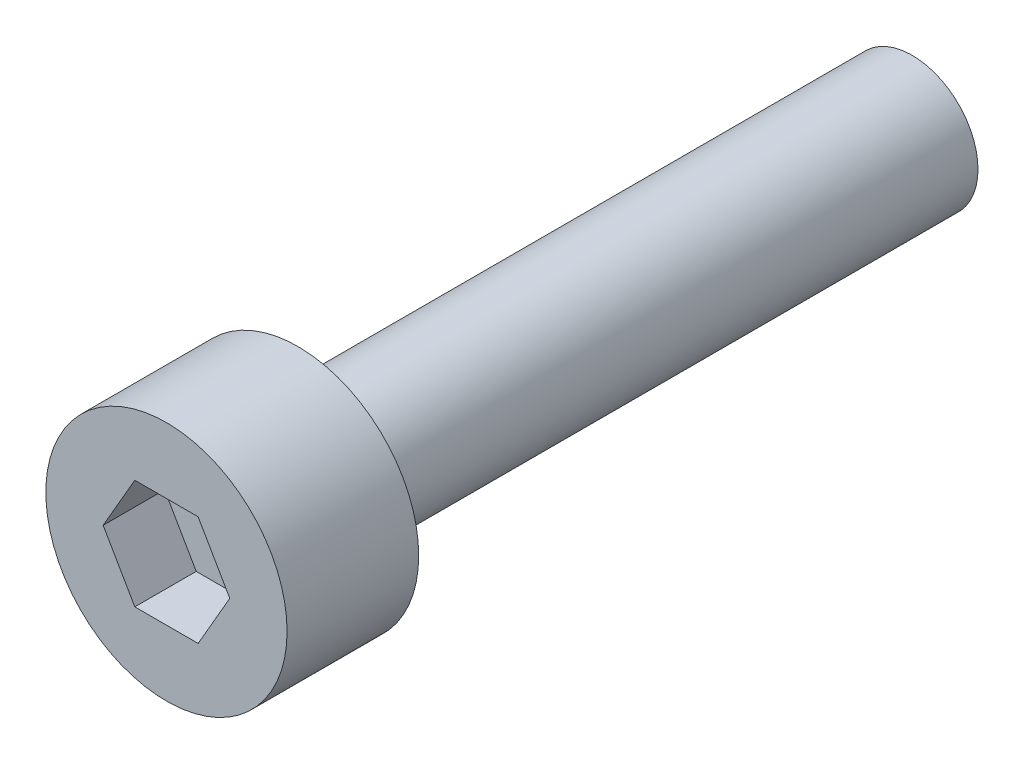
ISO-10303-21;
HEADER;
FILE_DESCRIPTION(('STEP AP214'),'2;1');
FILE_NAME('part.step','',(''),(''),'','','');
FILE_SCHEMA(('AUTOMOTIVE_DESIGN { 1 0 10303 214 1 1 1 1 }'));
ENDSEC;
DATA;
#1=APPLICATION_CONTEXT('core data for automotive mechanical design processes');
#2=APPLICATION_PROTOCOL_DEFINITION('international standard','automotive_design',2000,#1);
#3=PRODUCT_CONTEXT('',#1,'mechanical');
#4=PRODUCT('Part','Part','',(#3));
#5=PRODUCT_RELATED_PRODUCT_CATEGORY('part','',(#4));
#6=PRODUCT_DEFINITION_FORMATION('','',#4);
#7=PRODUCT_DEFINITION_CONTEXT('part definition',#1,'design');
#8=PRODUCT_DEFINITION('design','',#6,#7);
#9=PRODUCT_DEFINITION_SHAPE('','',#8);
#10=(LENGTH_UNIT() NAMED_UNIT(*) SI_UNIT(.MILLI.,.METRE.));
#11=(NAMED_UNIT(*) PLANE_ANGLE_UNIT() SI_UNIT($,.RADIAN.));
#12=(NAMED_UNIT(*) SI_UNIT($,.STERADIAN.) SOLID_ANGLE_UNIT());
#13=UNCERTAINTY_MEASURE_WITH_UNIT(LENGTH_MEASURE(1.E-05),#10,'distance_accuracy_value','');
#14=(GEOMETRIC_REPRESENTATION_CONTEXT(3) GLOBAL_UNCERTAINTY_ASSIGNED_CONTEXT((#13)) GLOBAL_UNIT_ASSIGNED_CONTEXT((#10,
#11,#12)) REPRESENTATION_CONTEXT('',''));
#15=CARTESIAN_POINT('',(0.,0.,0.));
#16=DIRECTION('',(0.,0.,1.));
#17=DIRECTION('',(1.,0.,0.));
#18=AXIS2_PLACEMENT_3D('',#15,#16,#17);
#19=CARTESIAN_POINT('',(0.,0.,3.));
#20=DIRECTION('',(0.,0.,1.));
#21=DIRECTION('',(1.,0.,0.));
#22=AXIS2_PLACEMENT_3D('',#19,#20,#21);
#23=PLANE('',#22);
#24=CARTESIAN_POINT('',(0.,0.,3.));
#25=DIRECTION('',(0.,0.,1.));
#26=DIRECTION('',(1.,0.,0.));
#27=AXIS2_PLACEMENT_3D('',#24,#25,#26);
#28=CIRCLE('',#27,2.75);
#29=CARTESIAN_POINT('',(2.75,0.,3.));
#30=VERTEX_POINT('',#29);
#31=EDGE_CURVE('E11',#30,#30,#28,.T.);
#32=ORIENTED_EDGE('',*,*,#31,.T.);
#33=EDGE_LOOP('',(#32));
#34=FACE_BOUND('',#33,.T.);
#35=DIRECTION('',(-0.5,0.866025403784439,0.));
#36=VECTOR('',#35,1.);
#37=CARTESIAN_POINT('',(1.44337567297406,0.,3.));
#38=LINE('',#37,#36);
#39=CARTESIAN_POINT('',(1.44337567297406,0.,3.));
#40=VERTEX_POINT('',#39);
#41=CARTESIAN_POINT('',(0.721687836487032,1.25,3.));
#42=VERTEX_POINT('',#41);
#43=EDGE_CURVE('E124',#40,#42,#38,.T.);
#44=ORIENTED_EDGE('',*,*,#43,.F.);
#45=DIRECTION('',(0.5,0.866025403784439,0.));
#46=VECTOR('',#45,1.);
#47=CARTESIAN_POINT('',(0.721687836487032,-1.25,3.));
#48=LINE('',#47,#46);
#49=CARTESIAN_POINT('',(0.721687836487032,-1.25,3.));
#50=VERTEX_POINT('',#49);
#51=EDGE_CURVE('E101',#50,#40,#48,.T.);
#52=ORIENTED_EDGE('',*,*,#51,.F.);
#53=DIRECTION('',(1.,0.,0.));
#54=VECTOR('',#53,1.);
#55=CARTESIAN_POINT('',(-0.721687836487033,-1.25,3.));
#56=LINE('',#55,#54);
#57=CARTESIAN_POINT('',(-0.721687836487033,-1.25,3.));
#58=VERTEX_POINT('',#57);
#59=EDGE_CURVE('E70',#58,#50,#56,.T.);
#60=ORIENTED_EDGE('',*,*,#59,.F.);
#61=DIRECTION('',(0.5,-0.866025403784439,0.));
#62=VECTOR('',#61,1.);
#63=CARTESIAN_POINT('',(-1.44337567297406,0.,3.));
#64=LINE('',#63,#62);
#65=CARTESIAN_POINT('',(-1.44337567297406,0.,3.));
#66=VERTEX_POINT('',#65);
#67=EDGE_CURVE('E135',#66,#58,#64,.T.);
#68=ORIENTED_EDGE('',*,*,#67,.F.);
#69=DIRECTION('',(-0.5,-0.866025403784439,0.));
#70=VECTOR('',#69,1.);
#71=CARTESIAN_POINT('',(-0.721687836487032,1.25,3.));
#72=LINE('',#71,#70);
#73=CARTESIAN_POINT('',(-0.721687836487032,1.25,3.));
#74=VERTEX_POINT('',#73);
#75=EDGE_CURVE('E122',#74,#66,#72,.T.);
#76=ORIENTED_EDGE('',*,*,#75,.F.);
#77=DIRECTION('',(-1.,0.,0.));
#78=VECTOR('',#77,1.);
#79=CARTESIAN_POINT('',(0.721687836487032,1.25,3.));
#80=LINE('',#79,#78);
#81=EDGE_CURVE('E109',#42,#74,#80,.T.);
#82=ORIENTED_EDGE('',*,*,#81,.F.);
#83=EDGE_LOOP('',(#44,#52,#60,#68,#76,#82));
#84=FACE_BOUND('',#83,.T.);
#85=ADVANCED_FACE('F50',(#34,#84),#23,.T.);
#86=CARTESIAN_POINT('',(0.,0.,3.));
#87=DIRECTION('',(0.,0.,-1.));
#88=DIRECTION('',(-1.,0.,0.));
#89=AXIS2_PLACEMENT_3D('',#86,#87,#88);
#90=CYLINDRICAL_SURFACE('',#89,2.75);
#91=ORIENTED_EDGE('',*,*,#31,.F.);
#92=EDGE_LOOP('',(#91));
#93=FACE_BOUND('',#92,.T.);
#94=CARTESIAN_POINT('',(0.,0.,0.));
#95=DIRECTION('',(0.,0.,1.));
#96=DIRECTION('',(1.,0.,0.));
#97=AXIS2_PLACEMENT_3D('',#94,#95,#96);
#98=CIRCLE('',#97,2.75);
#99=CARTESIAN_POINT('',(2.75,0.,0.));
#100=VERTEX_POINT('',#99);
#101=EDGE_CURVE('E51',#100,#100,#98,.T.);
#102=ORIENTED_EDGE('',*,*,#101,.T.);
#103=EDGE_LOOP('',(#102));
#104=FACE_BOUND('',#103,.T.);
#105=ADVANCED_FACE('F47',(#93,#104),#90,.T.);
#106=CARTESIAN_POINT('',(0.,0.,0.));
#107=DIRECTION('',(0.,0.,1.));
#108=DIRECTION('',(1.,0.,0.));
#109=AXIS2_PLACEMENT_3D('',#106,#107,#108);
#110=PLANE('',#109);
#111=CARTESIAN_POINT('',(0.,0.,0.));
#112=DIRECTION('',(0.,0.,1.));
#113=DIRECTION('',(1.,0.,0.));
#114=AXIS2_PLACEMENT_3D('',#111,#112,#113);
#115=CIRCLE('',#114,1.5);
#116=CARTESIAN_POINT('',(1.5,0.,0.));
#117=VERTEX_POINT('',#116);
#118=EDGE_CURVE('E156',#117,#117,#115,.T.);
#119=ORIENTED_EDGE('',*,*,#118,.T.);
#120=EDGE_LOOP('',(#119));
#121=FACE_BOUND('',#120,.T.);
#122=ORIENTED_EDGE('',*,*,#101,.F.);
#123=EDGE_LOOP('',(#122));
#124=FACE_BOUND('',#123,.T.);
#125=ADVANCED_FACE('F174',(#121,#124),#110,.F.);
#126=CARTESIAN_POINT('',(0.,0.,0.));
#127=DIRECTION('',(0.,0.,-1.));
#128=DIRECTION('',(-1.,0.,0.));
#129=AXIS2_PLACEMENT_3D('',#126,#127,#128);
#130=CYLINDRICAL_SURFACE('',#129,1.5);
#131=ORIENTED_EDGE('',*,*,#118,.F.);
#132=EDGE_LOOP('',(#131));
#133=FACE_BOUND('',#132,.T.);
#134=CARTESIAN_POINT('',(0.,0.,-14.));
#135=DIRECTION('',(0.,0.,1.));
#136=DIRECTION('',(1.,0.,0.));
#137=AXIS2_PLACEMENT_3D('',#134,#135,#136);
#138=CIRCLE('',#137,1.5);
#139=CARTESIAN_POINT('',(1.5,0.,-14.));
#140=VERTEX_POINT('',#139);
#141=EDGE_CURVE('E154',#140,#140,#138,.T.);
#142=ORIENTED_EDGE('',*,*,#141,.T.);
#143=EDGE_LOOP('',(#142));
#144=FACE_BOUND('',#143,.T.);
#145=ADVANCED_FACE('F165',(#133,#144),#130,.T.);
#146=CARTESIAN_POINT('',(0.,0.,-14.));
#147=DIRECTION('',(0.,0.,1.));
#148=DIRECTION('',(1.,0.,0.));
#149=AXIS2_PLACEMENT_3D('',#146,#147,#148);
#150=PLANE('',#149);
#151=ORIENTED_EDGE('',*,*,#141,.F.);
#152=EDGE_LOOP('',(#151));
#153=FACE_BOUND('',#152,.T.);
#154=ADVANCED_FACE('F163',(#153),#150,.F.);
#155=CARTESIAN_POINT('',(0.721687836487032,-1.25,3.));
#156=DIRECTION('',(-0.866025403784439,0.5,0.));
#157=DIRECTION('',(-0.5,-0.866025403784439,0.));
#158=AXIS2_PLACEMENT_3D('',#155,#156,#157);
#159=PLANE('',#158);
#160=DIRECTION('',(0.5,0.866025403784439,0.));
#161=VECTOR('',#160,1.);
#162=CARTESIAN_POINT('',(0.721687836487032,-1.25,1.6));
#163=LINE('',#162,#161);
#164=CARTESIAN_POINT('',(0.721687836487032,-1.25,1.6));
#165=VERTEX_POINT('',#164);
#166=CARTESIAN_POINT('',(1.44337567297406,0.,1.6));
#167=VERTEX_POINT('',#166);
#168=EDGE_CURVE('E136',#165,#167,#163,.T.);
#169=ORIENTED_EDGE('',*,*,#168,.F.);
#170=DIRECTION('',(0.,0.,-1.));
#171=VECTOR('',#170,1.);
#172=CARTESIAN_POINT('',(0.721687836487032,-1.25,3.));
#173=LINE('',#172,#171);
#174=EDGE_CURVE('E140',#50,#165,#173,.T.);
#175=ORIENTED_EDGE('',*,*,#174,.F.);
#176=ORIENTED_EDGE('',*,*,#51,.T.);
#177=DIRECTION('',(0.,0.,-1.));
#178=VECTOR('',#177,1.);
#179=CARTESIAN_POINT('',(1.44337567297406,0.,3.));
#180=LINE('',#179,#178);
#181=EDGE_CURVE('E153',#40,#167,#180,.T.);
#182=ORIENTED_EDGE('',*,*,#181,.T.);
#183=EDGE_LOOP('',(#169,#175,#176,#182));
#184=FACE_BOUND('',#183,.T.);
#185=ADVANCED_FACE('F167',(#184),#159,.T.);
#186=CARTESIAN_POINT('',(1.44337567297406,0.,3.));
#187=DIRECTION('',(-0.866025403784439,-0.5,0.));
#188=DIRECTION('',(0.5,-0.866025403784439,0.));
#189=AXIS2_PLACEMENT_3D('',#186,#187,#188);
#190=PLANE('',#189);
#191=DIRECTION('',(-0.5,0.866025403784439,0.));
#192=VECTOR('',#191,1.);
#193=CARTESIAN_POINT('',(1.44337567297406,0.,1.6));
#194=LINE('',#193,#192);
#195=CARTESIAN_POINT('',(0.721687836487032,1.25,1.6));
#196=VERTEX_POINT('',#195);
#197=EDGE_CURVE('E143',#167,#196,#194,.T.);
#198=ORIENTED_EDGE('',*,*,#197,.F.);
#199=ORIENTED_EDGE('',*,*,#181,.F.);
#200=ORIENTED_EDGE('',*,*,#43,.T.);
#201=DIRECTION('',(0.,0.,-1.));
#202=VECTOR('',#201,1.);
#203=CARTESIAN_POINT('',(0.721687836487032,1.25,3.));
#204=LINE('',#203,#202);
#205=EDGE_CURVE('E120',#42,#196,#204,.T.);
#206=ORIENTED_EDGE('',*,*,#205,.T.);
#207=EDGE_LOOP('',(#198,#199,#200,#206));
#208=FACE_BOUND('',#207,.T.);
#209=ADVANCED_FACE('F175',(#208),#190,.T.);
#210=CARTESIAN_POINT('',(0.721687836487032,1.25,3.));
#211=DIRECTION('',(0.,-1.,0.));
#212=DIRECTION('',(1.,0.,0.));
#213=AXIS2_PLACEMENT_3D('',#210,#211,#212);
#214=PLANE('',#213);
#215=DIRECTION('',(-1.,0.,0.));
#216=VECTOR('',#215,1.);
#217=CARTESIAN_POINT('',(0.721687836487032,1.25,1.6));
#218=LINE('',#217,#216);
#219=CARTESIAN_POINT('',(-0.721687836487032,1.25,1.6));
#220=VERTEX_POINT('',#219);
#221=EDGE_CURVE('E141',#196,#220,#218,.T.);
#222=ORIENTED_EDGE('',*,*,#221,.F.);
#223=ORIENTED_EDGE('',*,*,#205,.F.);
#224=ORIENTED_EDGE('',*,*,#81,.T.);
#225=DIRECTION('',(0.,0.,-1.));
#226=VECTOR('',#225,1.);
#227=CARTESIAN_POINT('',(-0.721687836487032,1.25,3.));
#228=LINE('',#227,#226);
#229=EDGE_CURVE('E111',#74,#220,#228,.T.);
#230=ORIENTED_EDGE('',*,*,#229,.T.);
#231=EDGE_LOOP('',(#222,#223,#224,#230));
#232=FACE_BOUND('',#231,.T.);
#233=ADVANCED_FACE('F114',(#232),#214,.T.);
#234=CARTESIAN_POINT('',(-0.721687836487032,1.25,3.));
#235=DIRECTION('',(0.866025403784438,-0.5,0.));
#236=DIRECTION('',(0.5,0.866025403784439,0.));
#237=AXIS2_PLACEMENT_3D('',#234,#235,#236);
#238=PLANE('',#237);
#239=DIRECTION('',(-0.5,-0.866025403784439,0.));
#240=VECTOR('',#239,1.);
#241=CARTESIAN_POINT('',(-0.721687836487032,1.25,1.6));
#242=LINE('',#241,#240);
#243=CARTESIAN_POINT('',(-1.44337567297406,0.,1.6));
#244=VERTEX_POINT('',#243);
#245=EDGE_CURVE('E126',#220,#244,#242,.T.);
#246=ORIENTED_EDGE('',*,*,#245,.F.);
#247=ORIENTED_EDGE('',*,*,#229,.F.);
#248=ORIENTED_EDGE('',*,*,#75,.T.);
#249=DIRECTION('',(0.,0.,-1.));
#250=VECTOR('',#249,1.);
#251=CARTESIAN_POINT('',(-1.44337567297406,0.,3.));
#252=LINE('',#251,#250);
#253=EDGE_CURVE('E129',#66,#244,#252,.T.);
#254=ORIENTED_EDGE('',*,*,#253,.T.);
#255=EDGE_LOOP('',(#246,#247,#248,#254));
#256=FACE_BOUND('',#255,.T.);
#257=ADVANCED_FACE('F123',(#256),#238,.T.);
#258=CARTESIAN_POINT('',(-1.44337567297406,0.,3.));
#259=DIRECTION('',(0.866025403784439,0.5,0.));
#260=DIRECTION('',(-0.5,0.866025403784439,0.));
#261=AXIS2_PLACEMENT_3D('',#258,#259,#260);
#262=PLANE('',#261);
#263=DIRECTION('',(0.5,-0.866025403784439,0.));
#264=VECTOR('',#263,1.);
#265=CARTESIAN_POINT('',(-1.44337567297406,0.,1.6));
#266=LINE('',#265,#264);
#267=CARTESIAN_POINT('',(-0.721687836487033,-1.25,1.6));
#268=VERTEX_POINT('',#267);
#269=EDGE_CURVE('E148',#244,#268,#266,.T.);
#270=ORIENTED_EDGE('',*,*,#269,.F.);
#271=ORIENTED_EDGE('',*,*,#253,.F.);
#272=ORIENTED_EDGE('',*,*,#67,.T.);
#273=DIRECTION('',(0.,0.,-1.));
#274=VECTOR('',#273,1.);
#275=CARTESIAN_POINT('',(-0.721687836487033,-1.25,3.));
#276=LINE('',#275,#274);
#277=EDGE_CURVE('E65',#58,#268,#276,.T.);
#278=ORIENTED_EDGE('',*,*,#277,.T.);
#279=EDGE_LOOP('',(#270,#271,#272,#278));
#280=FACE_BOUND('',#279,.T.);
#281=ADVANCED_FACE('F277',(#280),#262,.T.);
#282=CARTESIAN_POINT('',(-0.721687836487033,-1.25,3.));
#283=DIRECTION('',(0.,1.,0.));
#284=DIRECTION('',(-1.,0.,0.));
#285=AXIS2_PLACEMENT_3D('',#282,#283,#284);
#286=PLANE('',#285);
#287=DIRECTION('',(1.,0.,0.));
#288=VECTOR('',#287,1.);
#289=CARTESIAN_POINT('',(-0.721687836487033,-1.25,1.6));
#290=LINE('',#289,#288);
#291=EDGE_CURVE('E94',#268,#165,#290,.T.);
#292=ORIENTED_EDGE('',*,*,#291,.F.);
#293=ORIENTED_EDGE('',*,*,#277,.F.);
#294=ORIENTED_EDGE('',*,*,#59,.T.);
#295=ORIENTED_EDGE('',*,*,#174,.T.);
#296=EDGE_LOOP('',(#292,#293,#294,#295));
#297=FACE_BOUND('',#296,.T.);
#298=ADVANCED_FACE('F282',(#297),#286,.T.);
#299=CARTESIAN_POINT('',(0.,0.,1.6));
#300=DIRECTION('',(0.,0.,1.));
#301=DIRECTION('',(1.,0.,0.));
#302=AXIS2_PLACEMENT_3D('',#299,#300,#301);
#303=PLANE('',#302);
#304=ORIENTED_EDGE('',*,*,#168,.T.);
#305=ORIENTED_EDGE('',*,*,#197,.T.);
#306=ORIENTED_EDGE('',*,*,#221,.T.);
#307=ORIENTED_EDGE('',*,*,#245,.T.);
#308=ORIENTED_EDGE('',*,*,#269,.T.);
#309=ORIENTED_EDGE('',*,*,#291,.T.);
#310=EDGE_LOOP('',(#304,#305,#306,#307,#308,#309));
#311=FACE_BOUND('',#310,.T.);
#312=ADVANCED_FACE('F293',(#311),#303,.T.);
#313=CLOSED_SHELL('',(#85,#105,#125,#145,#154,#185,#209,#233,#257,#281,#298,#312));
#314=MANIFOLD_SOLID_BREP('B2',#313);
#315=ADVANCED_BREP_SHAPE_REPRESENTATION('',(#18,#314),#14);
#316=SHAPE_DEFINITION_REPRESENTATION(#9,#315);
ENDSEC;
END-ISO-10303-21;
